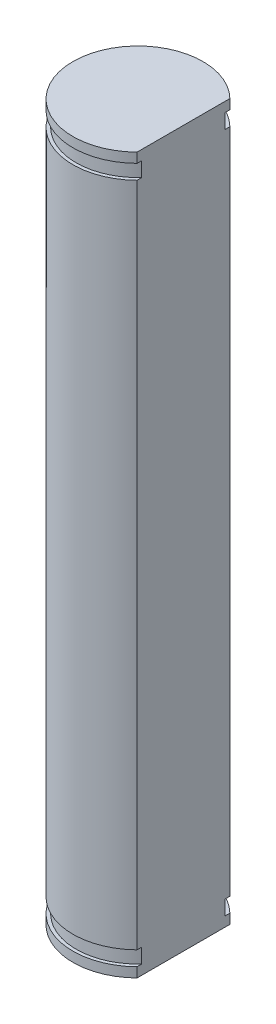
ISO-10303-21;
HEADER;
FILE_DESCRIPTION(('STEP AP214'),'2;1');
FILE_NAME('part.step','',(''),(''),'','','');
FILE_SCHEMA(('AUTOMOTIVE_DESIGN { 1 0 10303 214 1 1 1 1 }'));
ENDSEC;
DATA;
#1=APPLICATION_CONTEXT('core data for automotive mechanical design processes');
#2=APPLICATION_PROTOCOL_DEFINITION('international standard','automotive_design',2000,#1);
#3=PRODUCT_CONTEXT('',#1,'mechanical');
#4=PRODUCT('Part','Part','',(#3));
#5=PRODUCT_RELATED_PRODUCT_CATEGORY('part','',(#4));
#6=PRODUCT_DEFINITION_FORMATION('','',#4);
#7=PRODUCT_DEFINITION_CONTEXT('part definition',#1,'design');
#8=PRODUCT_DEFINITION('design','',#6,#7);
#9=PRODUCT_DEFINITION_SHAPE('','',#8);
#10=(LENGTH_UNIT() NAMED_UNIT(*) SI_UNIT(.MILLI.,.METRE.));
#11=(NAMED_UNIT(*) PLANE_ANGLE_UNIT() SI_UNIT($,.RADIAN.));
#12=(NAMED_UNIT(*) SI_UNIT($,.STERADIAN.) SOLID_ANGLE_UNIT());
#13=UNCERTAINTY_MEASURE_WITH_UNIT(LENGTH_MEASURE(1.E-05),#10,'distance_accuracy_value','');
#14=(GEOMETRIC_REPRESENTATION_CONTEXT(3) GLOBAL_UNCERTAINTY_ASSIGNED_CONTEXT((#13)) GLOBAL_UNIT_ASSIGNED_CONTEXT((#10,
#11,#12)) REPRESENTATION_CONTEXT('',''));
#15=CARTESIAN_POINT('',(0.,0.,0.));
#16=DIRECTION('',(0.,0.,1.));
#17=DIRECTION('',(1.,0.,0.));
#18=AXIS2_PLACEMENT_3D('',#15,#16,#17);
#19=CARTESIAN_POINT('',(0.,0.,0.));
#20=DIRECTION('',(0.,-1.,0.));
#21=DIRECTION('',(0.,0.,-1.));
#22=AXIS2_PLACEMENT_3D('',#19,#20,#21);
#23=PLANE('',#22);
#24=CARTESIAN_POINT('',(0.,0.,0.));
#25=DIRECTION('',(0.,-1.,0.));
#26=DIRECTION('',(0.,0.,-1.));
#27=AXIS2_PLACEMENT_3D('',#24,#25,#26);
#28=CIRCLE('',#27,4.);
#29=CARTESIAN_POINT('',(2.8,0.,2.85657137141714));
#30=VERTEX_POINT('',#29);
#31=CARTESIAN_POINT('',(2.8,0.,-2.85657137141714));
#32=VERTEX_POINT('',#31);
#33=EDGE_CURVE('E11',#30,#32,#28,.T.);
#34=ORIENTED_EDGE('',*,*,#33,.F.);
#35=DIRECTION('',(0.,0.,1.));
#36=VECTOR('',#35,1.);
#37=CARTESIAN_POINT('',(2.8,0.,2.85657137141714));
#38=LINE('',#37,#36);
#39=EDGE_CURVE('E113',#32,#30,#38,.T.);
#40=ORIENTED_EDGE('',*,*,#39,.F.);
#41=EDGE_LOOP('',(#34,#40));
#42=FACE_BOUND('',#41,.T.);
#43=ADVANCED_FACE('F32',(#42),#23,.F.);
#44=CARTESIAN_POINT('',(0.,-44.,0.));
#45=DIRECTION('',(0.,-1.,0.));
#46=DIRECTION('',(0.,0.,-1.));
#47=AXIS2_PLACEMENT_3D('',#44,#45,#46);
#48=CYLINDRICAL_SURFACE('',#47,4.);
#49=ORIENTED_EDGE('',*,*,#33,.T.);
#50=DIRECTION('',(0.,1.,0.));
#51=VECTOR('',#50,1.);
#52=CARTESIAN_POINT('',(2.8,-44.,-2.85657137141714));
#53=LINE('',#52,#51);
#54=CARTESIAN_POINT('',(2.8,-0.600000000000003,-2.85657137141714));
#55=VERTEX_POINT('',#54);
#56=EDGE_CURVE('E112',#55,#32,#53,.T.);
#57=ORIENTED_EDGE('',*,*,#56,.F.);
#58=CARTESIAN_POINT('',(0.,-0.600000000000003,0.));
#59=DIRECTION('',(0.,-1.,0.));
#60=DIRECTION('',(0.,0.,-1.));
#61=AXIS2_PLACEMENT_3D('',#58,#59,#60);
#62=CIRCLE('',#61,4.);
#63=CARTESIAN_POINT('',(2.8,-0.600000000000003,2.85657137141714));
#64=VERTEX_POINT('',#63);
#65=EDGE_CURVE('E39',#64,#55,#62,.T.);
#66=ORIENTED_EDGE('',*,*,#65,.F.);
#67=DIRECTION('',(0.,1.,0.));
#68=VECTOR('',#67,1.);
#69=CARTESIAN_POINT('',(2.8,-44.,2.85657137141714));
#70=LINE('',#69,#68);
#71=EDGE_CURVE('E121',#64,#30,#70,.T.);
#72=ORIENTED_EDGE('',*,*,#71,.T.);
#73=EDGE_LOOP('',(#49,#57,#66,#72));
#74=FACE_BOUND('',#73,.T.);
#75=ADVANCED_FACE('F158',(#74),#48,.T.);
#76=CARTESIAN_POINT('',(-4.,-0.600000000000001,0.));
#77=DIRECTION('',(0.,1.,0.));
#78=DIRECTION('',(0.,0.,1.));
#79=AXIS2_PLACEMENT_3D('',#76,#77,#78);
#80=PLANE('',#79);
#81=ORIENTED_EDGE('',*,*,#65,.T.);
#82=DIRECTION('',(0.,0.,1.));
#83=VECTOR('',#82,1.);
#84=CARTESIAN_POINT('',(2.8,-0.600000000000001,0.));
#85=LINE('',#84,#83);
#86=CARTESIAN_POINT('',(2.8,-0.600000000000003,-2.56904651573302));
#87=VERTEX_POINT('',#86);
#88=EDGE_CURVE('E130',#55,#87,#85,.T.);
#89=ORIENTED_EDGE('',*,*,#88,.T.);
#90=CARTESIAN_POINT('',(0.,-0.600000000000003,0.));
#91=DIRECTION('',(0.,-1.,0.));
#92=DIRECTION('',(0.,0.,-1.));
#93=AXIS2_PLACEMENT_3D('',#90,#91,#92);
#94=CIRCLE('',#93,3.8);
#95=CARTESIAN_POINT('',(2.8,-0.600000000000003,2.56904651573302));
#96=VERTEX_POINT('',#95);
#97=EDGE_CURVE('E147',#96,#87,#94,.T.);
#98=ORIENTED_EDGE('',*,*,#97,.F.);
#99=EDGE_CURVE('E53',#96,#64,#85,.T.);
#100=ORIENTED_EDGE('',*,*,#99,.T.);
#101=EDGE_LOOP('',(#81,#89,#98,#100));
#102=FACE_BOUND('',#101,.T.);
#103=ADVANCED_FACE('F153',(#102),#80,.F.);
#104=CARTESIAN_POINT('',(0.,-44.,0.));
#105=DIRECTION('',(0.,-1.,0.));
#106=DIRECTION('',(0.,0.,-1.));
#107=AXIS2_PLACEMENT_3D('',#104,#105,#106);
#108=CYLINDRICAL_SURFACE('',#107,3.8);
#109=ORIENTED_EDGE('',*,*,#97,.T.);
#110=DIRECTION('',(0.,-1.,0.));
#111=VECTOR('',#110,1.);
#112=CARTESIAN_POINT('',(2.8,-44.,-2.56904651573302));
#113=LINE('',#112,#111);
#114=CARTESIAN_POINT('',(2.8,-1.5,-2.56904651573302));
#115=VERTEX_POINT('',#114);
#116=EDGE_CURVE('E180',#87,#115,#113,.T.);
#117=ORIENTED_EDGE('',*,*,#116,.T.);
#118=CARTESIAN_POINT('',(0.,-1.5,0.));
#119=DIRECTION('',(0.,-1.,0.));
#120=DIRECTION('',(0.,0.,-1.));
#121=AXIS2_PLACEMENT_3D('',#118,#119,#120);
#122=CIRCLE('',#121,3.8);
#123=CARTESIAN_POINT('',(2.8,-1.5,2.56904651573302));
#124=VERTEX_POINT('',#123);
#125=EDGE_CURVE('E144',#124,#115,#122,.T.);
#126=ORIENTED_EDGE('',*,*,#125,.F.);
#127=DIRECTION('',(0.,-1.,0.));
#128=VECTOR('',#127,1.);
#129=CARTESIAN_POINT('',(2.8,-44.,2.56904651573302));
#130=LINE('',#129,#128);
#131=EDGE_CURVE('E128',#124,#96,#130,.F.);
#132=ORIENTED_EDGE('',*,*,#131,.T.);
#133=EDGE_LOOP('',(#109,#117,#126,#132));
#134=FACE_BOUND('',#133,.T.);
#135=ADVANCED_FACE('F188',(#134),#108,.T.);
#136=CARTESIAN_POINT('',(-3.8,-1.5,0.));
#137=DIRECTION('',(0.,-1.,0.));
#138=DIRECTION('',(0.,0.,-1.));
#139=AXIS2_PLACEMENT_3D('',#136,#137,#138);
#140=PLANE('',#139);
#141=CARTESIAN_POINT('',(0.,-1.5,0.));
#142=DIRECTION('',(0.,-1.,0.));
#143=DIRECTION('',(0.,0.,-1.));
#144=AXIS2_PLACEMENT_3D('',#141,#142,#143);
#145=CIRCLE('',#144,4.);
#146=CARTESIAN_POINT('',(2.8,-1.5,2.85657137141714));
#147=VERTEX_POINT('',#146);
#148=CARTESIAN_POINT('',(2.8,-1.5,-2.85657137141714));
#149=VERTEX_POINT('',#148);
#150=EDGE_CURVE('E141',#147,#149,#145,.T.);
#151=ORIENTED_EDGE('',*,*,#150,.F.);
#152=DIRECTION('',(0.,0.,-1.));
#153=VECTOR('',#152,1.);
#154=CARTESIAN_POINT('',(2.8,-1.5,0.));
#155=LINE('',#154,#153);
#156=EDGE_CURVE('E181',#147,#124,#155,.T.);
#157=ORIENTED_EDGE('',*,*,#156,.T.);
#158=ORIENTED_EDGE('',*,*,#125,.T.);
#159=EDGE_CURVE('E177',#115,#149,#155,.T.);
#160=ORIENTED_EDGE('',*,*,#159,.T.);
#161=EDGE_LOOP('',(#151,#157,#158,#160));
#162=FACE_BOUND('',#161,.T.);
#163=ADVANCED_FACE('F196',(#162),#140,.F.);
#164=CARTESIAN_POINT('',(0.,-44.,0.));
#165=DIRECTION('',(0.,-1.,0.));
#166=DIRECTION('',(0.,0.,-1.));
#167=AXIS2_PLACEMENT_3D('',#164,#165,#166);
#168=CYLINDRICAL_SURFACE('',#167,4.);
#169=ORIENTED_EDGE('',*,*,#150,.T.);
#170=CARTESIAN_POINT('',(2.8,-42.5,-2.85657137141714));
#171=VERTEX_POINT('',#170);
#172=EDGE_CURVE('E122',#171,#149,#53,.T.);
#173=ORIENTED_EDGE('',*,*,#172,.F.);
#174=CARTESIAN_POINT('',(0.,-42.5,0.));
#175=DIRECTION('',(0.,-1.,0.));
#176=DIRECTION('',(0.,0.,-1.));
#177=AXIS2_PLACEMENT_3D('',#174,#175,#176);
#178=CIRCLE('',#177,3.99999999999999);
#179=CARTESIAN_POINT('',(2.8,-42.5,2.85657137141714));
#180=VERTEX_POINT('',#179);
#181=EDGE_CURVE('E138',#180,#171,#178,.T.);
#182=ORIENTED_EDGE('',*,*,#181,.F.);
#183=EDGE_CURVE('E190',#180,#147,#70,.T.);
#184=ORIENTED_EDGE('',*,*,#183,.T.);
#185=EDGE_LOOP('',(#169,#173,#182,#184));
#186=FACE_BOUND('',#185,.T.);
#187=ADVANCED_FACE('F194',(#186),#168,.T.);
#188=CARTESIAN_POINT('',(-3.99999999999999,-42.5,0.));
#189=DIRECTION('',(0.,1.,0.));
#190=DIRECTION('',(0.,0.,1.));
#191=AXIS2_PLACEMENT_3D('',#188,#189,#190);
#192=PLANE('',#191);
#193=ORIENTED_EDGE('',*,*,#181,.T.);
#194=DIRECTION('',(0.,0.,1.));
#195=VECTOR('',#194,1.);
#196=CARTESIAN_POINT('',(2.8,-42.5,0.));
#197=LINE('',#196,#195);
#198=CARTESIAN_POINT('',(2.8,-42.5,-2.56904651573302));
#199=VERTEX_POINT('',#198);
#200=EDGE_CURVE('E170',#171,#199,#197,.T.);
#201=ORIENTED_EDGE('',*,*,#200,.T.);
#202=CARTESIAN_POINT('',(0.,-42.5,0.));
#203=DIRECTION('',(0.,-1.,0.));
#204=DIRECTION('',(0.,0.,-1.));
#205=AXIS2_PLACEMENT_3D('',#202,#203,#204);
#206=CIRCLE('',#205,3.79999999999999);
#207=CARTESIAN_POINT('',(2.8,-42.5,2.56904651573302));
#208=VERTEX_POINT('',#207);
#209=EDGE_CURVE('E135',#208,#199,#206,.T.);
#210=ORIENTED_EDGE('',*,*,#209,.F.);
#211=EDGE_CURVE('E173',#208,#180,#197,.T.);
#212=ORIENTED_EDGE('',*,*,#211,.T.);
#213=EDGE_LOOP('',(#193,#201,#210,#212));
#214=FACE_BOUND('',#213,.T.);
#215=ADVANCED_FACE('F198',(#214),#192,.F.);
#216=CARTESIAN_POINT('',(0.,-44.,0.));
#217=DIRECTION('',(0.,-1.,0.));
#218=DIRECTION('',(0.,0.,-1.));
#219=AXIS2_PLACEMENT_3D('',#216,#217,#218);
#220=CYLINDRICAL_SURFACE('',#219,3.79999999999999);
#221=ORIENTED_EDGE('',*,*,#209,.T.);
#222=DIRECTION('',(0.,-1.,0.));
#223=VECTOR('',#222,1.);
#224=CARTESIAN_POINT('',(2.8,-44.,-2.56904651573302));
#225=LINE('',#224,#223);
#226=CARTESIAN_POINT('',(2.8,-43.4,-2.56904651573302));
#227=VERTEX_POINT('',#226);
#228=EDGE_CURVE('E166',#199,#227,#225,.T.);
#229=ORIENTED_EDGE('',*,*,#228,.T.);
#230=CARTESIAN_POINT('',(0.,-43.4,0.));
#231=DIRECTION('',(0.,-1.,0.));
#232=DIRECTION('',(0.,0.,-1.));
#233=AXIS2_PLACEMENT_3D('',#230,#231,#232);
#234=CIRCLE('',#233,3.79999999999999);
#235=CARTESIAN_POINT('',(2.8,-43.4,2.56904651573302));
#236=VERTEX_POINT('',#235);
#237=EDGE_CURVE('E126',#236,#227,#234,.T.);
#238=ORIENTED_EDGE('',*,*,#237,.F.);
#239=DIRECTION('',(0.,-1.,0.));
#240=VECTOR('',#239,1.);
#241=CARTESIAN_POINT('',(2.8,-44.,2.56904651573302));
#242=LINE('',#241,#240);
#243=EDGE_CURVE('E174',#236,#208,#242,.F.);
#244=ORIENTED_EDGE('',*,*,#243,.T.);
#245=EDGE_LOOP('',(#221,#229,#238,#244));
#246=FACE_BOUND('',#245,.T.);
#247=ADVANCED_FACE('F203',(#246),#220,.T.);
#248=CARTESIAN_POINT('',(-3.79999999999999,-43.4,0.));
#249=DIRECTION('',(0.,-1.,0.));
#250=DIRECTION('',(0.,0.,-1.));
#251=AXIS2_PLACEMENT_3D('',#248,#249,#250);
#252=PLANE('',#251);
#253=CARTESIAN_POINT('',(0.,-43.4,0.));
#254=DIRECTION('',(0.,-1.,0.));
#255=DIRECTION('',(0.,0.,-1.));
#256=AXIS2_PLACEMENT_3D('',#253,#254,#255);
#257=CIRCLE('',#256,3.99999999999999);
#258=CARTESIAN_POINT('',(2.8,-43.4,2.85657137141714));
#259=VERTEX_POINT('',#258);
#260=CARTESIAN_POINT('',(2.8,-43.4,-2.85657137141714));
#261=VERTEX_POINT('',#260);
#262=EDGE_CURVE('E120',#259,#261,#257,.T.);
#263=ORIENTED_EDGE('',*,*,#262,.F.);
#264=DIRECTION('',(0.,0.,-1.));
#265=VECTOR('',#264,1.);
#266=CARTESIAN_POINT('',(2.8,-43.4,0.));
#267=LINE('',#266,#265);
#268=EDGE_CURVE('E167',#259,#236,#267,.T.);
#269=ORIENTED_EDGE('',*,*,#268,.T.);
#270=ORIENTED_EDGE('',*,*,#237,.T.);
#271=EDGE_CURVE('E164',#227,#261,#267,.T.);
#272=ORIENTED_EDGE('',*,*,#271,.T.);
#273=EDGE_LOOP('',(#263,#269,#270,#272));
#274=FACE_BOUND('',#273,.T.);
#275=ADVANCED_FACE('F205',(#274),#252,.F.);
#276=CARTESIAN_POINT('',(0.,-44.,0.));
#277=DIRECTION('',(0.,-1.,0.));
#278=DIRECTION('',(0.,0.,-1.));
#279=AXIS2_PLACEMENT_3D('',#276,#277,#278);
#280=CYLINDRICAL_SURFACE('',#279,3.99999999999999);
#281=ORIENTED_EDGE('',*,*,#262,.T.);
#282=CARTESIAN_POINT('',(2.8,-44.,-2.85657137141714));
#283=VERTEX_POINT('',#282);
#284=EDGE_CURVE('E107',#283,#261,#53,.T.);
#285=ORIENTED_EDGE('',*,*,#284,.F.);
#286=CARTESIAN_POINT('',(0.,-44.,0.));
#287=DIRECTION('',(0.,-1.,0.));
#288=DIRECTION('',(0.,0.,-1.));
#289=AXIS2_PLACEMENT_3D('',#286,#287,#288);
#290=CIRCLE('',#289,3.99999999999999);
#291=CARTESIAN_POINT('',(2.8,-44.,2.85657137141713));
#292=VERTEX_POINT('',#291);
#293=EDGE_CURVE('E118',#292,#283,#290,.T.);
#294=ORIENTED_EDGE('',*,*,#293,.F.);
#295=EDGE_CURVE('E46',#292,#259,#70,.T.);
#296=ORIENTED_EDGE('',*,*,#295,.T.);
#297=EDGE_LOOP('',(#281,#285,#294,#296));
#298=FACE_BOUND('',#297,.T.);
#299=ADVANCED_FACE('F117',(#298),#280,.T.);
#300=CARTESIAN_POINT('',(-3.99999999999999,-44.,0.));
#301=DIRECTION('',(0.,1.,0.));
#302=DIRECTION('',(0.,0.,1.));
#303=AXIS2_PLACEMENT_3D('',#300,#301,#302);
#304=PLANE('',#303);
#305=ORIENTED_EDGE('',*,*,#293,.T.);
#306=DIRECTION('',(0.,0.,1.));
#307=VECTOR('',#306,1.);
#308=CARTESIAN_POINT('',(2.8,-44.,2.85657137141714));
#309=LINE('',#308,#307);
#310=EDGE_CURVE('E104',#283,#292,#309,.T.);
#311=ORIENTED_EDGE('',*,*,#310,.T.);
#312=EDGE_LOOP('',(#305,#311));
#313=FACE_BOUND('',#312,.T.);
#314=ADVANCED_FACE('F124',(#313),#304,.F.);
#315=CARTESIAN_POINT('',(2.8,-44.,2.85657137141714));
#316=DIRECTION('',(-1.,0.,0.));
#317=DIRECTION('',(0.,0.,1.));
#318=AXIS2_PLACEMENT_3D('',#315,#316,#317);
#319=PLANE('',#318);
#320=ORIENTED_EDGE('',*,*,#131,.F.);
#321=ORIENTED_EDGE('',*,*,#156,.F.);
#322=ORIENTED_EDGE('',*,*,#183,.F.);
#323=ORIENTED_EDGE('',*,*,#211,.F.);
#324=ORIENTED_EDGE('',*,*,#243,.F.);
#325=ORIENTED_EDGE('',*,*,#268,.F.);
#326=ORIENTED_EDGE('',*,*,#295,.F.);
#327=ORIENTED_EDGE('',*,*,#310,.F.);
#328=ORIENTED_EDGE('',*,*,#284,.T.);
#329=ORIENTED_EDGE('',*,*,#271,.F.);
#330=ORIENTED_EDGE('',*,*,#228,.F.);
#331=ORIENTED_EDGE('',*,*,#200,.F.);
#332=ORIENTED_EDGE('',*,*,#172,.T.);
#333=ORIENTED_EDGE('',*,*,#159,.F.);
#334=ORIENTED_EDGE('',*,*,#116,.F.);
#335=ORIENTED_EDGE('',*,*,#88,.F.);
#336=ORIENTED_EDGE('',*,*,#56,.T.);
#337=ORIENTED_EDGE('',*,*,#39,.T.);
#338=ORIENTED_EDGE('',*,*,#71,.F.);
#339=ORIENTED_EDGE('',*,*,#99,.F.);
#340=EDGE_LOOP('',(#320,#321,#322,#323,#324,#325,#326,#327,#328,#329,#330,#331,#332,#333,#334,
#335,#336,#337,#338,#339));
#341=FACE_BOUND('',#340,.T.);
#342=ADVANCED_FACE('F106',(#341),#319,.F.);
#343=CLOSED_SHELL('',(#43,#75,#103,#135,#163,#187,#215,#247,#275,#299,#314,#342));
#344=MANIFOLD_SOLID_BREP('B2',#343);
#345=ADVANCED_BREP_SHAPE_REPRESENTATION('',(#18,#344),#14);
#346=SHAPE_DEFINITION_REPRESENTATION(#9,#345);
ENDSEC;
END-ISO-10303-21;
